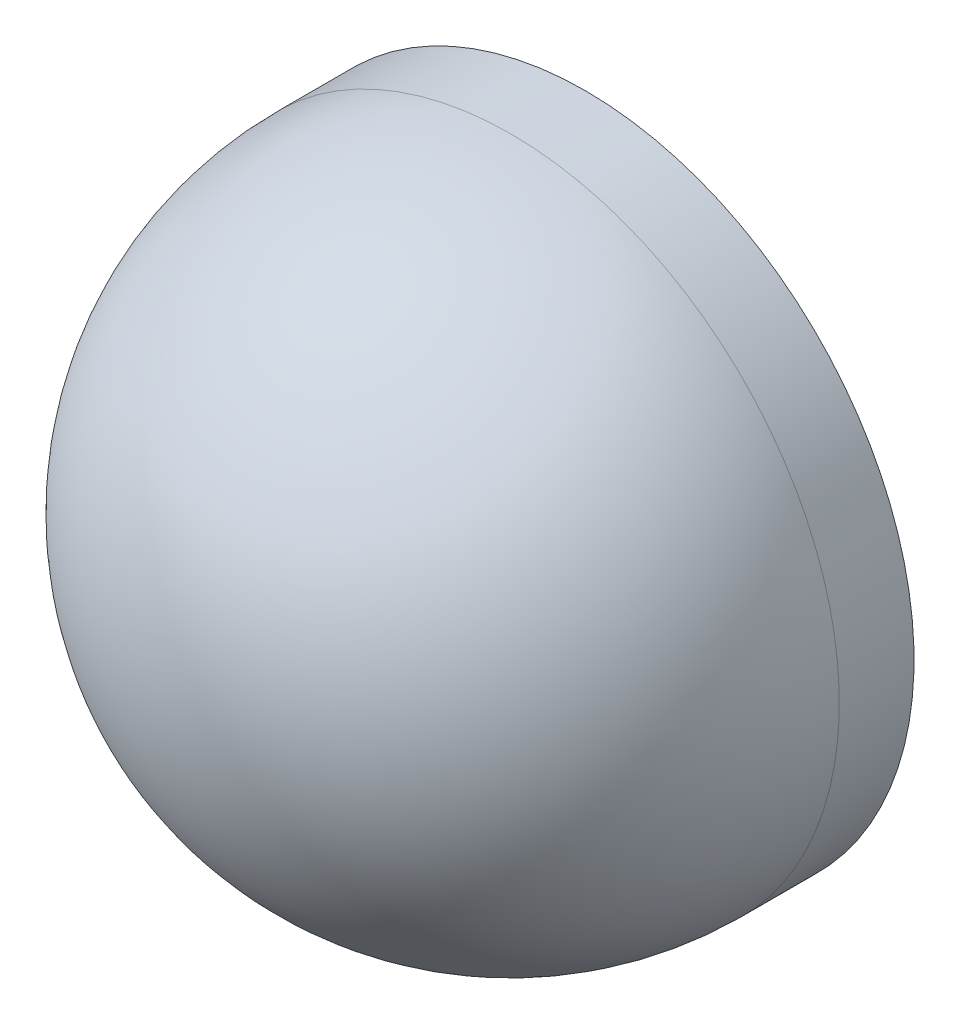
ISO-10303-21;
HEADER;
FILE_DESCRIPTION(('STEP AP214'),'2;1');
FILE_NAME('part.step','',(''),(''),'','','');
FILE_SCHEMA(('AUTOMOTIVE_DESIGN { 1 0 10303 214 1 1 1 1 }'));
ENDSEC;
DATA;
#1=APPLICATION_CONTEXT('core data for automotive mechanical design processes');
#2=APPLICATION_PROTOCOL_DEFINITION('international standard','automotive_design',2000,#1);
#3=PRODUCT_CONTEXT('',#1,'mechanical');
#4=PRODUCT('Part','Part','',(#3));
#5=PRODUCT_RELATED_PRODUCT_CATEGORY('part','',(#4));
#6=PRODUCT_DEFINITION_FORMATION('','',#4);
#7=PRODUCT_DEFINITION_CONTEXT('part definition',#1,'design');
#8=PRODUCT_DEFINITION('design','',#6,#7);
#9=PRODUCT_DEFINITION_SHAPE('','',#8);
#10=(LENGTH_UNIT() NAMED_UNIT(*) SI_UNIT(.MILLI.,.METRE.));
#11=(NAMED_UNIT(*) PLANE_ANGLE_UNIT() SI_UNIT($,.RADIAN.));
#12=(NAMED_UNIT(*) SI_UNIT($,.STERADIAN.) SOLID_ANGLE_UNIT());
#13=UNCERTAINTY_MEASURE_WITH_UNIT(LENGTH_MEASURE(1.E-05),#10,'distance_accuracy_value','');
#14=(GEOMETRIC_REPRESENTATION_CONTEXT(3) GLOBAL_UNCERTAINTY_ASSIGNED_CONTEXT((#13)) GLOBAL_UNIT_ASSIGNED_CONTEXT((#10,
#11,#12)) REPRESENTATION_CONTEXT('',''));
#15=CARTESIAN_POINT('',(0.,0.,0.));
#16=DIRECTION('',(0.,0.,1.));
#17=DIRECTION('',(1.,0.,0.));
#18=AXIS2_PLACEMENT_3D('',#15,#16,#17);
#19=CARTESIAN_POINT('',(0.,0.,0.));
#20=DIRECTION('',(-1.,0.,0.));
#21=DIRECTION('',(0.,-1.,0.));
#22=AXIS2_PLACEMENT_3D('',#19,#20,#21);
#23=SPHERICAL_SURFACE('',#22,13.2);
#24=CARTESIAN_POINT('',(0.,0.,0.));
#25=DIRECTION('',(0.,0.,-1.));
#26=DIRECTION('',(0.,1.,0.));
#27=AXIS2_PLACEMENT_3D('',#24,#25,#26);
#28=SPHERICAL_SURFACE('',#27,13.2);
#29=CARTESIAN_POINT('',(0.,0.,0.));
#30=DIRECTION('',(0.,0.,-1.));
#31=DIRECTION('',(0.,1.,0.));
#32=AXIS2_PLACEMENT_3D('',#29,#30,#31);
#33=CIRCLE('',#32,13.2);
#34=CARTESIAN_POINT('',(0.,13.2,0.));
#35=VERTEX_POINT('',#34);
#36=EDGE_CURVE('E52',#35,#35,#33,.T.);
#37=ORIENTED_EDGE('',*,*,#36,.F.);
#38=EDGE_LOOP('',(#37));
#39=FACE_BOUND('',#38,.T.);
#40=ADVANCED_FACE('F39',(#39),#28,.T.);
#41=CARTESIAN_POINT('',(0.,0.,-3.));
#42=DIRECTION('',(0.,0.,-1.));
#43=DIRECTION('',(0.,1.,0.));
#44=AXIS2_PLACEMENT_3D('',#41,#42,#43);
#45=PLANE('',#44);
#46=CARTESIAN_POINT('',(0.,0.,-3.));
#47=DIRECTION('',(0.,0.,-1.));
#48=DIRECTION('',(0.,1.,0.));
#49=AXIS2_PLACEMENT_3D('',#46,#47,#48);
#50=CIRCLE('',#49,13.2);
#51=CARTESIAN_POINT('',(0.,13.2,-2.99999999999991));
#52=VERTEX_POINT('',#51);
#53=EDGE_CURVE('E47',#52,#52,#50,.T.);
#54=ORIENTED_EDGE('',*,*,#53,.T.);
#55=EDGE_LOOP('',(#54));
#56=FACE_BOUND('',#55,.T.);
#57=CARTESIAN_POINT('',(0.,0.,-3.));
#58=DIRECTION('',(0.,0.,-1.));
#59=DIRECTION('',(0.,1.,0.));
#60=AXIS2_PLACEMENT_3D('',#57,#58,#59);
#61=CIRCLE('',#60,11.7);
#62=CARTESIAN_POINT('',(0.,11.7,-2.99999999999992));
#63=VERTEX_POINT('',#62);
#64=EDGE_CURVE('E58',#63,#63,#61,.T.);
#65=ORIENTED_EDGE('',*,*,#64,.F.);
#66=EDGE_LOOP('',(#65));
#67=FACE_BOUND('',#66,.T.);
#68=ADVANCED_FACE('F66',(#56,#67),#45,.T.);
#69=CARTESIAN_POINT('',(0.,0.,-3.));
#70=DIRECTION('',(0.,0.,1.));
#71=DIRECTION('',(0.,-1.,0.));
#72=AXIS2_PLACEMENT_3D('',#69,#70,#71);
#73=CYLINDRICAL_SURFACE('',#72,13.2);
#74=ORIENTED_EDGE('',*,*,#53,.F.);
#75=EDGE_LOOP('',(#74));
#76=FACE_BOUND('',#75,.T.);
#77=ORIENTED_EDGE('',*,*,#36,.T.);
#78=EDGE_LOOP('',(#77));
#79=FACE_BOUND('',#78,.T.);
#80=ADVANCED_FACE('F68',(#76,#79),#73,.T.);
#81=CARTESIAN_POINT('',(0.,0.,-3.));
#82=DIRECTION('',(0.,0.,1.));
#83=DIRECTION('',(0.,-1.,0.));
#84=AXIS2_PLACEMENT_3D('',#81,#82,#83);
#85=CYLINDRICAL_SURFACE('',#84,11.7);
#86=ORIENTED_EDGE('',*,*,#64,.T.);
#87=EDGE_LOOP('',(#86));
#88=FACE_BOUND('',#87,.T.);
#89=CARTESIAN_POINT('',(0.,0.,0.));
#90=DIRECTION('',(0.,0.,-1.));
#91=DIRECTION('',(1.,0.,0.));
#92=AXIS2_PLACEMENT_3D('',#89,#90,#91);
#93=CIRCLE('',#92,11.7);
#94=CARTESIAN_POINT('',(11.7,0.,0.));
#95=VERTEX_POINT('',#94);
#96=EDGE_CURVE('E10',#95,#95,#93,.F.);
#97=ORIENTED_EDGE('',*,*,#96,.T.);
#98=EDGE_LOOP('',(#97));
#99=FACE_BOUND('',#98,.T.);
#100=ADVANCED_FACE('F64',(#88,#99),#85,.F.);
#101=CARTESIAN_POINT('',(0.,0.,0.));
#102=DIRECTION('',(-1.,0.,0.));
#103=DIRECTION('',(0.,-1.,0.));
#104=AXIS2_PLACEMENT_3D('',#101,#102,#103);
#105=SPHERICAL_SURFACE('',#104,11.7);
#106=CARTESIAN_POINT('',(0.,0.,0.));
#107=DIRECTION('',(0.,0.,-1.));
#108=DIRECTION('',(1.,0.,0.));
#109=AXIS2_PLACEMENT_3D('',#106,#107,#108);
#110=SPHERICAL_SURFACE('',#109,11.7);
#111=ORIENTED_EDGE('',*,*,#96,.F.);
#112=EDGE_LOOP('',(#111));
#113=FACE_BOUND('',#112,.T.);
#114=ADVANCED_FACE('F41',(#113),#110,.F.);
#115=CLOSED_SHELL('',(#40,#68,#80,#100,#114));
#116=MANIFOLD_SOLID_BREP('B2',#115);
#117=ADVANCED_BREP_SHAPE_REPRESENTATION('',(#18,#116),#14);
#118=SHAPE_DEFINITION_REPRESENTATION(#9,#117);
ENDSEC;
END-ISO-10303-21;
